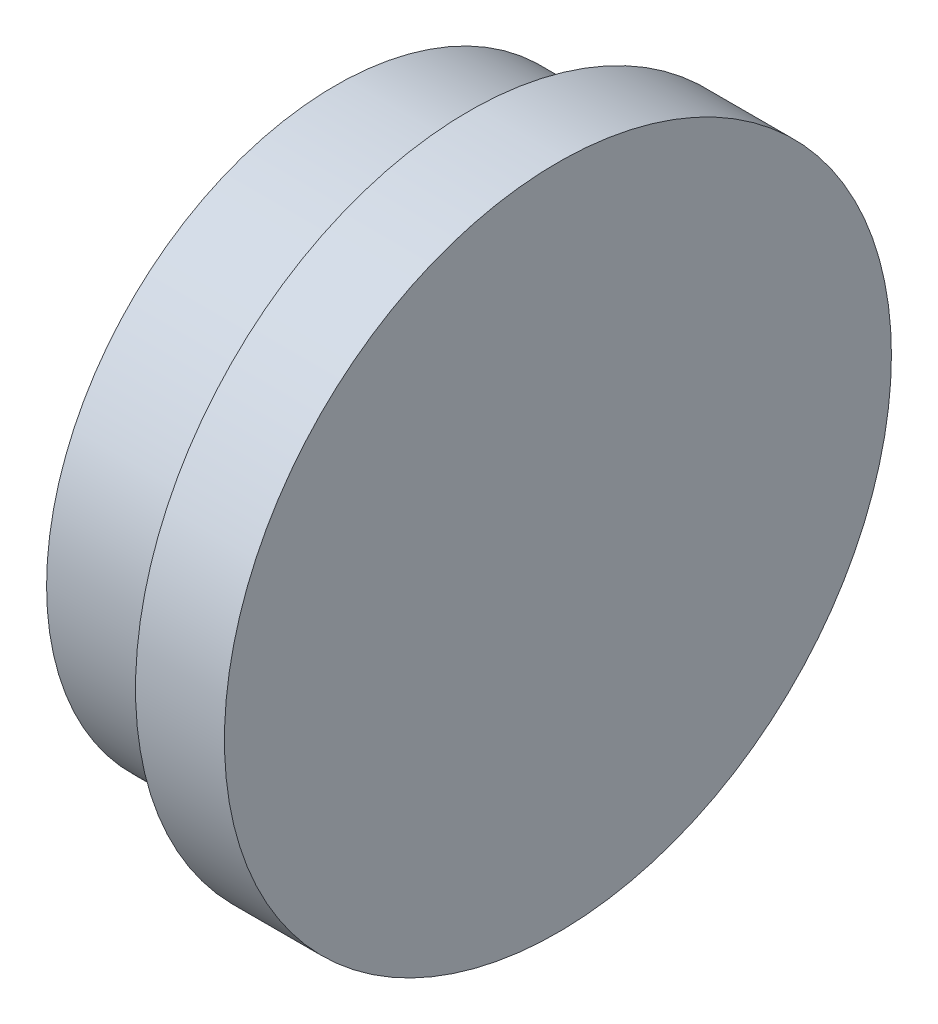
ISO-10303-21;
HEADER;
FILE_DESCRIPTION(('STEP AP214'),'2;1');
FILE_NAME('part.step','',(''),(''),'','','');
FILE_SCHEMA(('AUTOMOTIVE_DESIGN { 1 0 10303 214 1 1 1 1 }'));
ENDSEC;
DATA;
#1=APPLICATION_CONTEXT('core data for automotive mechanical design processes');
#2=APPLICATION_PROTOCOL_DEFINITION('international standard','automotive_design',2000,#1);
#3=PRODUCT_CONTEXT('',#1,'mechanical');
#4=PRODUCT('Part','Part','',(#3));
#5=PRODUCT_RELATED_PRODUCT_CATEGORY('part','',(#4));
#6=PRODUCT_DEFINITION_FORMATION('','',#4);
#7=PRODUCT_DEFINITION_CONTEXT('part definition',#1,'design');
#8=PRODUCT_DEFINITION('design','',#6,#7);
#9=PRODUCT_DEFINITION_SHAPE('','',#8);
#10=(LENGTH_UNIT() NAMED_UNIT(*) SI_UNIT(.MILLI.,.METRE.));
#11=(NAMED_UNIT(*) PLANE_ANGLE_UNIT() SI_UNIT($,.RADIAN.));
#12=(NAMED_UNIT(*) SI_UNIT($,.STERADIAN.) SOLID_ANGLE_UNIT());
#13=UNCERTAINTY_MEASURE_WITH_UNIT(LENGTH_MEASURE(1.E-05),#10,'distance_accuracy_value','');
#14=(GEOMETRIC_REPRESENTATION_CONTEXT(3) GLOBAL_UNCERTAINTY_ASSIGNED_CONTEXT((#13)) GLOBAL_UNIT_ASSIGNED_CONTEXT((#10,
#11,#12)) REPRESENTATION_CONTEXT('',''));
#15=CARTESIAN_POINT('',(0.,0.,0.));
#16=DIRECTION('',(0.,0.,1.));
#17=DIRECTION('',(1.,0.,0.));
#18=AXIS2_PLACEMENT_3D('',#15,#16,#17);
#19=CARTESIAN_POINT('',(7.62,0.,0.));
#20=DIRECTION('',(-1.,0.,0.));
#21=DIRECTION('',(0.,0.,1.));
#22=AXIS2_PLACEMENT_3D('',#19,#20,#21);
#23=CYLINDRICAL_SURFACE('',#22,16.51);
#24=CARTESIAN_POINT('',(7.62,0.,0.));
#25=DIRECTION('',(1.,0.,0.));
#26=DIRECTION('',(0.,0.,-1.));
#27=AXIS2_PLACEMENT_3D('',#24,#25,#26);
#28=CIRCLE('',#27,16.51);
#29=CARTESIAN_POINT('',(7.62,0.,16.51));
#30=VERTEX_POINT('',#29);
#31=EDGE_CURVE('E10',#30,#30,#28,.T.);
#32=CARTESIAN_POINT('',(0.,0.,0.));
#33=DIRECTION('',(1.,0.,0.));
#34=DIRECTION('',(0.,0.,-1.));
#35=AXIS2_PLACEMENT_3D('',#32,#33,#34);
#36=CIRCLE('',#35,16.51);
#37=CARTESIAN_POINT('',(0.,0.,16.51));
#38=VERTEX_POINT('',#37);
#39=EDGE_CURVE('E44',#38,#38,#36,.T.);
#40=CARTESIAN_POINT('',(7.62,0.,16.51));
#41=CARTESIAN_POINT('',(7.540625,0.,16.51));
#42=CARTESIAN_POINT('',(7.46125,0.,16.51));
#43=CARTESIAN_POINT('',(7.3025,0.,16.51));
#44=CARTESIAN_POINT('',(7.223125,0.,16.51));
#45=CARTESIAN_POINT('',(7.064375,0.,16.51));
#46=CARTESIAN_POINT('',(6.985,0.,16.51));
#47=CARTESIAN_POINT('',(6.82625,0.,16.51));
#48=CARTESIAN_POINT('',(6.746875,0.,16.51));
#49=CARTESIAN_POINT('',(6.588125,0.,16.51));
#50=CARTESIAN_POINT('',(6.50875,0.,16.51));
#51=CARTESIAN_POINT('',(6.35,0.,16.51));
#52=CARTESIAN_POINT('',(6.270625,0.,16.51));
#53=CARTESIAN_POINT('',(6.111875,0.,16.51));
#54=CARTESIAN_POINT('',(6.0325,0.,16.51));
#55=CARTESIAN_POINT('',(5.87375,0.,16.51));
#56=CARTESIAN_POINT('',(5.794375,0.,16.51));
#57=CARTESIAN_POINT('',(5.635625,0.,16.51));
#58=CARTESIAN_POINT('',(5.55625,0.,16.51));
#59=CARTESIAN_POINT('',(5.3975,0.,16.51));
#60=CARTESIAN_POINT('',(5.318125,0.,16.51));
#61=CARTESIAN_POINT('',(5.159375,0.,16.51));
#62=CARTESIAN_POINT('',(5.08,0.,16.51));
#63=CARTESIAN_POINT('',(4.92125,0.,16.51));
#64=CARTESIAN_POINT('',(4.841875,0.,16.51));
#65=CARTESIAN_POINT('',(4.683125,0.,16.51));
#66=CARTESIAN_POINT('',(4.60375,0.,16.51));
#67=CARTESIAN_POINT('',(4.445,0.,16.51));
#68=CARTESIAN_POINT('',(4.365625,0.,16.51));
#69=CARTESIAN_POINT('',(4.206875,0.,16.51));
#70=CARTESIAN_POINT('',(4.1275,0.,16.51));
#71=CARTESIAN_POINT('',(3.96875,0.,16.51));
#72=CARTESIAN_POINT('',(3.889375,0.,16.51));
#73=CARTESIAN_POINT('',(3.730625,0.,16.51));
#74=CARTESIAN_POINT('',(3.65125,0.,16.51));
#75=CARTESIAN_POINT('',(3.4925,0.,16.51));
#76=CARTESIAN_POINT('',(3.413125,0.,16.51));
#77=CARTESIAN_POINT('',(3.254375,0.,16.51));
#78=CARTESIAN_POINT('',(3.175,0.,16.51));
#79=CARTESIAN_POINT('',(3.01625,0.,16.51));
#80=CARTESIAN_POINT('',(2.936875,0.,16.51));
#81=CARTESIAN_POINT('',(2.778125,0.,16.51));
#82=CARTESIAN_POINT('',(2.69875,0.,16.51));
#83=CARTESIAN_POINT('',(2.54,0.,16.51));
#84=CARTESIAN_POINT('',(2.460625,0.,16.51));
#85=CARTESIAN_POINT('',(2.301875,0.,16.51));
#86=CARTESIAN_POINT('',(2.2225,0.,16.51));
#87=CARTESIAN_POINT('',(2.06375,0.,16.51));
#88=CARTESIAN_POINT('',(1.984375,0.,16.51));
#89=CARTESIAN_POINT('',(1.825625,0.,16.51));
#90=CARTESIAN_POINT('',(1.74625,0.,16.51));
#91=CARTESIAN_POINT('',(1.5875,0.,16.51));
#92=CARTESIAN_POINT('',(1.508125,0.,16.51));
#93=CARTESIAN_POINT('',(1.349375,0.,16.51));
#94=CARTESIAN_POINT('',(1.27,0.,16.51));
#95=CARTESIAN_POINT('',(1.11125,0.,16.51));
#96=CARTESIAN_POINT('',(1.031875,0.,16.51));
#97=CARTESIAN_POINT('',(0.873125,0.,16.51));
#98=CARTESIAN_POINT('',(0.79375,0.,16.51));
#99=CARTESIAN_POINT('',(0.635,0.,16.51));
#100=CARTESIAN_POINT('',(0.555625,0.,16.51));
#101=CARTESIAN_POINT('',(0.396875,0.,16.51));
#102=CARTESIAN_POINT('',(0.3175,0.,16.51));
#103=CARTESIAN_POINT('',(0.15875,0.,16.51));
#104=CARTESIAN_POINT('',(0.0793749999999999,0.,16.51));
#105=CARTESIAN_POINT('',(0.,0.,16.51));
#106=B_SPLINE_CURVE_WITH_KNOTS('',3,(#40,#41,#42,#43,#44,#45,#46,#47,#48,#49,#50,#51,#52,#53,
#54,#55,#56,#57,#58,#59,#60,#61,#62,#63,#64,#65,#66,#67,#68,#69,#70,#71,#72,#73,#74,#75,#76,#77,
#78,#79,#80,#81,#82,#83,#84,#85,#86,#87,#88,#89,#90,#91,#92,#93,#94,#95,#96,#97,#98,#99,#100,
#101,#102,#103,#104,#105),.UNSPECIFIED.,.F.,.F.,(4,2,2,2,2,2,2,2,2,2,2,2,2,2,2,2,2,2,2,2,2,2,2,
2,2,2,2,2,2,2,2,2,4),(0.,0.238125,0.476249999999999,0.714375,0.952499999999999,1.190625,1.42875,
1.666875,1.905,2.143125,2.38125,2.619375,2.8575,3.095625,3.33375,3.571875,3.81,4.048125,4.28625,
4.524375,4.7625,5.000625,5.23875,5.476875,5.715,5.953125,6.19125,6.429375,6.6675,6.905625,
7.14375,7.381875,7.62),.UNSPECIFIED.);
#107=EDGE_CURVE('BSEAM41',#30,#38,#106,.T.);
#108=ORIENTED_EDGE('',*,*,#31,.F.);
#109=ORIENTED_EDGE('',*,*,#39,.T.);
#110=ORIENTED_EDGE('',*,*,#107,.T.);
#111=ORIENTED_EDGE('',*,*,#107,.F.);
#112=EDGE_LOOP('',(#108,#110,#109,#111));
#113=FACE_BOUND('',#112,.T.);
#114=ADVANCED_FACE('F41',(#113),#23,.T.);
#115=CARTESIAN_POINT('',(0.,0.,0.));
#116=DIRECTION('',(1.,0.,0.));
#117=DIRECTION('',(0.,0.,-1.));
#118=AXIS2_PLACEMENT_3D('',#115,#116,#117);
#119=PLANE('',#118);
#120=ORIENTED_EDGE('',*,*,#39,.F.);
#121=EDGE_LOOP('',(#120));
#122=FACE_BOUND('',#121,.T.);
#123=ADVANCED_FACE('F68',(#122),#119,.F.);
#124=CARTESIAN_POINT('',(12.7,0.,0.));
#125=DIRECTION('',(-1.,0.,0.));
#126=DIRECTION('',(0.,0.,1.));
#127=AXIS2_PLACEMENT_3D('',#124,#125,#126);
#128=CYLINDRICAL_SURFACE('',#127,19.05);
#129=CARTESIAN_POINT('',(12.7,0.,0.));
#130=DIRECTION('',(1.,0.,0.));
#131=DIRECTION('',(0.,0.,-1.));
#132=AXIS2_PLACEMENT_3D('',#129,#130,#131);
#133=CIRCLE('',#132,19.05);
#134=CARTESIAN_POINT('',(12.7,0.,-19.05));
#135=VERTEX_POINT('',#134);
#136=EDGE_CURVE('E54',#135,#135,#133,.T.);
#137=ORIENTED_EDGE('',*,*,#136,.F.);
#138=EDGE_LOOP('',(#137));
#139=FACE_BOUND('',#138,.T.);
#140=CARTESIAN_POINT('',(7.62,0.,0.));
#141=DIRECTION('',(1.,0.,0.));
#142=DIRECTION('',(0.,0.,-1.));
#143=AXIS2_PLACEMENT_3D('',#140,#141,#142);
#144=CIRCLE('',#143,19.05);
#145=CARTESIAN_POINT('',(7.62,0.,-19.05));
#146=VERTEX_POINT('',#145);
#147=EDGE_CURVE('E56',#146,#146,#144,.T.);
#148=ORIENTED_EDGE('',*,*,#147,.T.);
#149=EDGE_LOOP('',(#148));
#150=FACE_BOUND('',#149,.T.);
#151=ADVANCED_FACE('F65',(#139,#150),#128,.T.);
#152=CARTESIAN_POINT('',(12.7,0.,0.));
#153=DIRECTION('',(1.,0.,0.));
#154=DIRECTION('',(0.,0.,-1.));
#155=AXIS2_PLACEMENT_3D('',#152,#153,#154);
#156=PLANE('',#155);
#157=ORIENTED_EDGE('',*,*,#136,.T.);
#158=EDGE_LOOP('',(#157));
#159=FACE_BOUND('',#158,.T.);
#160=ADVANCED_FACE('F63',(#159),#156,.T.);
#161=CARTESIAN_POINT('',(7.62,0.,0.));
#162=DIRECTION('',(1.,0.,0.));
#163=DIRECTION('',(0.,0.,-1.));
#164=AXIS2_PLACEMENT_3D('',#161,#162,#163);
#165=PLANE('',#164);
#166=ORIENTED_EDGE('',*,*,#31,.T.);
#167=EDGE_LOOP('',(#166));
#168=FACE_BOUND('',#167,.T.);
#169=ORIENTED_EDGE('',*,*,#147,.F.);
#170=EDGE_LOOP('',(#169));
#171=FACE_BOUND('',#170,.T.);
#172=ADVANCED_FACE('F72',(#168,#171),#165,.F.);
#173=CLOSED_SHELL('',(#114,#123,#151,#160,#172));
#174=MANIFOLD_SOLID_BREP('B2',#173);
#175=ADVANCED_BREP_SHAPE_REPRESENTATION('',(#18,#174),#14);
#176=SHAPE_DEFINITION_REPRESENTATION(#9,#175);
ENDSEC;
END-ISO-10303-21;
